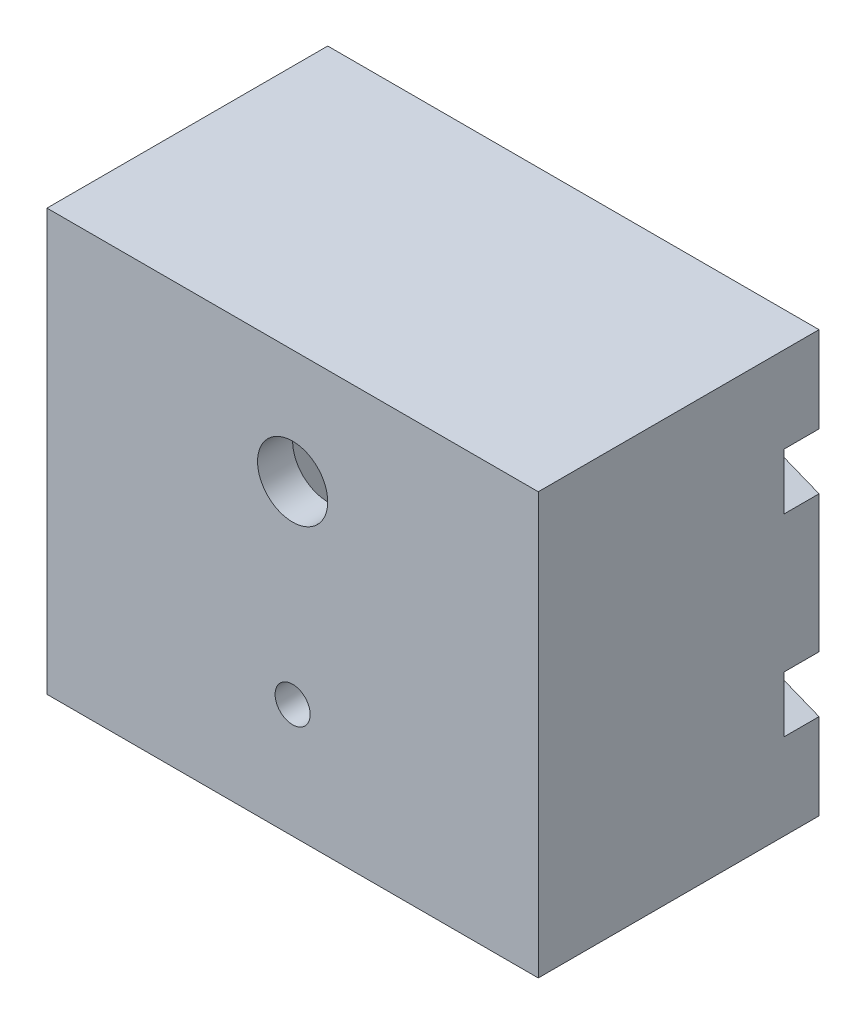
ISO-10303-21;
HEADER;
FILE_DESCRIPTION(('STEP AP214'),'2;1');
FILE_NAME('part.step','',(''),(''),'','','');
FILE_SCHEMA(('AUTOMOTIVE_DESIGN { 1 0 10303 214 1 1 1 1 }'));
ENDSEC;
DATA;
#1=APPLICATION_CONTEXT('core data for automotive mechanical design processes');
#2=APPLICATION_PROTOCOL_DEFINITION('international standard','automotive_design',2000,#1);
#3=PRODUCT_CONTEXT('',#1,'mechanical');
#4=PRODUCT('Part','Part','',(#3));
#5=PRODUCT_RELATED_PRODUCT_CATEGORY('part','',(#4));
#6=PRODUCT_DEFINITION_FORMATION('','',#4);
#7=PRODUCT_DEFINITION_CONTEXT('part definition',#1,'design');
#8=PRODUCT_DEFINITION('design','',#6,#7);
#9=PRODUCT_DEFINITION_SHAPE('','',#8);
#10=(LENGTH_UNIT() NAMED_UNIT(*) SI_UNIT(.MILLI.,.METRE.));
#11=(NAMED_UNIT(*) PLANE_ANGLE_UNIT() SI_UNIT($,.RADIAN.));
#12=(NAMED_UNIT(*) SI_UNIT($,.STERADIAN.) SOLID_ANGLE_UNIT());
#13=UNCERTAINTY_MEASURE_WITH_UNIT(LENGTH_MEASURE(1.E-05),#10,'distance_accuracy_value','');
#14=(GEOMETRIC_REPRESENTATION_CONTEXT(3) GLOBAL_UNCERTAINTY_ASSIGNED_CONTEXT((#13)) GLOBAL_UNIT_ASSIGNED_CONTEXT((#10,
#11,#12)) REPRESENTATION_CONTEXT('',''));
#15=CARTESIAN_POINT('',(0.,0.,0.));
#16=DIRECTION('',(0.,0.,1.));
#17=DIRECTION('',(1.,0.,0.));
#18=AXIS2_PLACEMENT_3D('',#15,#16,#17);
#19=CARTESIAN_POINT('',(0.,0.,0.));
#20=DIRECTION('',(0.,0.,-1.));
#21=DIRECTION('',(-1.,0.,0.));
#22=AXIS2_PLACEMENT_3D('',#19,#20,#21);
#23=PLANE('',#22);
#24=DIRECTION('',(0.928476690885259,0.371390676354104,0.));
#25=VECTOR('',#24,1.);
#26=CARTESIAN_POINT('',(44.45,12.85875,0.));
#27=LINE('',#26,#25);
#28=CARTESIAN_POINT('',(41.275,11.58875,0.));
#29=VERTEX_POINT('',#28);
#30=CARTESIAN_POINT('',(44.45,12.85875,0.));
#31=VERTEX_POINT('',#30);
#32=EDGE_CURVE('E459',#29,#31,#27,.T.);
#33=ORIENTED_EDGE('',*,*,#32,.F.);
#34=DIRECTION('',(0.,-1.,0.));
#35=VECTOR('',#34,1.);
#36=CARTESIAN_POINT('',(41.275,3.175,0.));
#37=LINE('',#36,#35);
#38=CARTESIAN_POINT('',(41.275,26.51125,0.));
#39=VERTEX_POINT('',#38);
#40=EDGE_CURVE('E318',#39,#29,#37,.T.);
#41=ORIENTED_EDGE('',*,*,#40,.F.);
#42=DIRECTION('',(-0.928476690885259,0.371390676354104,0.));
#43=VECTOR('',#42,1.);
#44=CARTESIAN_POINT('',(44.45,25.24125,0.));
#45=LINE('',#44,#43);
#46=CARTESIAN_POINT('',(44.45,25.24125,0.));
#47=VERTEX_POINT('',#46);
#48=EDGE_CURVE('E431',#47,#39,#45,.T.);
#49=ORIENTED_EDGE('',*,*,#48,.F.);
#50=DIRECTION('',(0.,1.,0.));
#51=VECTOR('',#50,1.);
#52=CARTESIAN_POINT('',(44.45,0.,0.));
#53=LINE('',#52,#51);
#54=EDGE_CURVE('E258',#31,#47,#53,.T.);
#55=ORIENTED_EDGE('',*,*,#54,.F.);
#56=EDGE_LOOP('',(#33,#41,#49,#55));
#57=FACE_BOUND('',#56,.T.);
#58=ADVANCED_FACE('F45',(#57),#23,.T.);
#59=DIRECTION('',(-0.928476690885259,-0.371390676354104,0.));
#60=VECTOR('',#59,1.);
#61=CARTESIAN_POINT('',(0.,25.24125,0.));
#62=LINE('',#61,#60);
#63=CARTESIAN_POINT('',(3.175,26.51125,0.));
#64=VERTEX_POINT('',#63);
#65=CARTESIAN_POINT('',(0.,25.24125,0.));
#66=VERTEX_POINT('',#65);
#67=EDGE_CURVE('E405',#64,#66,#62,.T.);
#68=ORIENTED_EDGE('',*,*,#67,.F.);
#69=DIRECTION('',(0.,1.,0.));
#70=VECTOR('',#69,1.);
#71=CARTESIAN_POINT('',(3.175,3.175,0.));
#72=LINE('',#71,#70);
#73=CARTESIAN_POINT('',(3.175,11.58875,0.));
#74=VERTEX_POINT('',#73);
#75=EDGE_CURVE('E230',#74,#64,#72,.T.);
#76=ORIENTED_EDGE('',*,*,#75,.F.);
#77=DIRECTION('',(0.928476690885259,-0.371390676354104,0.));
#78=VECTOR('',#77,1.);
#79=CARTESIAN_POINT('',(0.,12.85875,0.));
#80=LINE('',#79,#78);
#81=CARTESIAN_POINT('',(0.,12.85875,0.));
#82=VERTEX_POINT('',#81);
#83=EDGE_CURVE('E213',#82,#74,#80,.T.);
#84=ORIENTED_EDGE('',*,*,#83,.F.);
#85=DIRECTION('',(0.,-1.,0.));
#86=VECTOR('',#85,1.);
#87=CARTESIAN_POINT('',(0.,0.,0.));
#88=LINE('',#87,#86);
#89=EDGE_CURVE('E228',#66,#82,#88,.T.);
#90=ORIENTED_EDGE('',*,*,#89,.F.);
#91=EDGE_LOOP('',(#68,#76,#84,#90));
#92=FACE_BOUND('',#91,.T.);
#93=ADVANCED_FACE('F227',(#92),#23,.T.);
#94=DIRECTION('',(0.928476690885259,-0.371390676354104,0.));
#95=VECTOR('',#94,1.);
#96=CARTESIAN_POINT('',(3.175,29.05125,0.));
#97=LINE('',#96,#95);
#98=CARTESIAN_POINT('',(0.,30.32125,0.));
#99=VERTEX_POINT('',#98);
#100=CARTESIAN_POINT('',(3.175,29.05125,0.));
#101=VERTEX_POINT('',#100);
#102=EDGE_CURVE('E379',#99,#101,#97,.T.);
#103=ORIENTED_EDGE('',*,*,#102,.F.);
#104=CARTESIAN_POINT('',(0.,38.1,0.));
#105=VERTEX_POINT('',#104);
#106=EDGE_CURVE('E238',#105,#99,#88,.T.);
#107=ORIENTED_EDGE('',*,*,#106,.F.);
#108=DIRECTION('',(-1.,0.,0.));
#109=VECTOR('',#108,1.);
#110=CARTESIAN_POINT('',(0.,38.1,0.));
#111=LINE('',#110,#109);
#112=CARTESIAN_POINT('',(44.45,38.1,0.));
#113=VERTEX_POINT('',#112);
#114=EDGE_CURVE('E257',#113,#105,#111,.T.);
#115=ORIENTED_EDGE('',*,*,#114,.F.);
#116=CARTESIAN_POINT('',(44.45,30.32125,0.));
#117=VERTEX_POINT('',#116);
#118=EDGE_CURVE('E252',#117,#113,#53,.T.);
#119=ORIENTED_EDGE('',*,*,#118,.F.);
#120=DIRECTION('',(0.928476690885259,0.371390676354104,0.));
#121=VECTOR('',#120,1.);
#122=CARTESIAN_POINT('',(41.275,29.05125,0.));
#123=LINE('',#122,#121);
#124=CARTESIAN_POINT('',(41.275,29.05125,0.));
#125=VERTEX_POINT('',#124);
#126=EDGE_CURVE('E421',#125,#117,#123,.T.);
#127=ORIENTED_EDGE('',*,*,#126,.F.);
#128=CARTESIAN_POINT('',(41.275,34.925,0.));
#129=VERTEX_POINT('',#128);
#130=EDGE_CURVE('E313',#129,#125,#37,.T.);
#131=ORIENTED_EDGE('',*,*,#130,.F.);
#132=DIRECTION('',(1.,0.,0.));
#133=VECTOR('',#132,1.);
#134=CARTESIAN_POINT('',(41.275,34.925,0.));
#135=LINE('',#134,#133);
#136=CARTESIAN_POINT('',(3.175,34.925,0.));
#137=VERTEX_POINT('',#136);
#138=EDGE_CURVE('E300',#137,#129,#135,.T.);
#139=ORIENTED_EDGE('',*,*,#138,.F.);
#140=EDGE_CURVE('E322',#101,#137,#72,.T.);
#141=ORIENTED_EDGE('',*,*,#140,.F.);
#142=EDGE_LOOP('',(#103,#107,#115,#119,#127,#131,#139,#141));
#143=FACE_BOUND('',#142,.T.);
#144=ADVANCED_FACE('F376',(#143),#23,.T.);
#145=CARTESIAN_POINT('',(0.,0.,25.4));
#146=DIRECTION('',(1.,0.,0.));
#147=DIRECTION('',(0.,0.,-1.));
#148=AXIS2_PLACEMENT_3D('',#145,#146,#147);
#149=PLANE('',#148);
#150=DIRECTION('',(0.,1.,0.));
#151=VECTOR('',#150,1.);
#152=CARTESIAN_POINT('',(0.,25.24125,3.175));
#153=LINE('',#152,#151);
#154=CARTESIAN_POINT('',(0.,25.24125,3.175));
#155=VERTEX_POINT('',#154);
#156=CARTESIAN_POINT('',(0.,30.32125,3.175));
#157=VERTEX_POINT('',#156);
#158=EDGE_CURVE('E383',#155,#157,#153,.T.);
#159=ORIENTED_EDGE('',*,*,#158,.F.);
#160=DIRECTION('',(0.,0.,-1.));
#161=VECTOR('',#160,1.);
#162=CARTESIAN_POINT('',(0.,25.24125,3.175));
#163=LINE('',#162,#161);
#164=EDGE_CURVE('E232',#155,#66,#163,.T.);
#165=ORIENTED_EDGE('',*,*,#164,.T.);
#166=ORIENTED_EDGE('',*,*,#89,.T.);
#167=DIRECTION('',(0.,0.,-1.));
#168=VECTOR('',#167,1.);
#169=CARTESIAN_POINT('',(0.,12.85875,3.175));
#170=LINE('',#169,#168);
#171=CARTESIAN_POINT('',(0.,12.85875,3.175));
#172=VERTEX_POINT('',#171);
#173=EDGE_CURVE('E209',#172,#82,#170,.T.);
#174=ORIENTED_EDGE('',*,*,#173,.F.);
#175=DIRECTION('',(0.,1.,0.));
#176=VECTOR('',#175,1.);
#177=CARTESIAN_POINT('',(0.,12.85875,3.175));
#178=LINE('',#177,#176);
#179=CARTESIAN_POINT('',(0.,7.77874999999999,3.175));
#180=VERTEX_POINT('',#179);
#181=EDGE_CURVE('E737',#180,#172,#178,.T.);
#182=ORIENTED_EDGE('',*,*,#181,.F.);
#183=DIRECTION('',(0.,0.,-1.));
#184=VECTOR('',#183,1.);
#185=CARTESIAN_POINT('',(0.,7.77874999999999,3.175));
#186=LINE('',#185,#184);
#187=CARTESIAN_POINT('',(0.,7.77874999999999,0.));
#188=VERTEX_POINT('',#187);
#189=EDGE_CURVE('E221',#180,#188,#186,.T.);
#190=ORIENTED_EDGE('',*,*,#189,.T.);
#191=CARTESIAN_POINT('',(0.,0.,0.));
#192=VERTEX_POINT('',#191);
#193=EDGE_CURVE('E239',#188,#192,#88,.T.);
#194=ORIENTED_EDGE('',*,*,#193,.T.);
#195=DIRECTION('',(0.,0.,-1.));
#196=VECTOR('',#195,1.);
#197=CARTESIAN_POINT('',(0.,0.,25.4));
#198=LINE('',#197,#196);
#199=CARTESIAN_POINT('',(0.,0.,25.4));
#200=VERTEX_POINT('',#199);
#201=EDGE_CURVE('E11',#200,#192,#198,.T.);
#202=ORIENTED_EDGE('',*,*,#201,.F.);
#203=DIRECTION('',(0.,-1.,0.));
#204=VECTOR('',#203,1.);
#205=CARTESIAN_POINT('',(0.,0.,25.4));
#206=LINE('',#205,#204);
#207=CARTESIAN_POINT('',(0.,38.1,25.4));
#208=VERTEX_POINT('',#207);
#209=EDGE_CURVE('E261',#208,#200,#206,.T.);
#210=ORIENTED_EDGE('',*,*,#209,.F.);
#211=DIRECTION('',(0.,0.,-1.));
#212=VECTOR('',#211,1.);
#213=CARTESIAN_POINT('',(0.,38.1,25.4));
#214=LINE('',#213,#212);
#215=EDGE_CURVE('E262',#208,#105,#214,.T.);
#216=ORIENTED_EDGE('',*,*,#215,.T.);
#217=ORIENTED_EDGE('',*,*,#106,.T.);
#218=DIRECTION('',(0.,0.,-1.));
#219=VECTOR('',#218,1.);
#220=CARTESIAN_POINT('',(0.,30.32125,3.175));
#221=LINE('',#220,#219);
#222=EDGE_CURVE('E381',#157,#99,#221,.T.);
#223=ORIENTED_EDGE('',*,*,#222,.F.);
#224=EDGE_LOOP('',(#159,#165,#166,#174,#182,#190,#194,#202,#210,#216,#217,#223));
#225=FACE_BOUND('',#224,.T.);
#226=ADVANCED_FACE('F47',(#225),#149,.F.);
#227=CARTESIAN_POINT('',(0.,0.,25.4));
#228=DIRECTION('',(0.,1.,0.));
#229=DIRECTION('',(0.,0.,1.));
#230=AXIS2_PLACEMENT_3D('',#227,#228,#229);
#231=PLANE('',#230);
#232=DIRECTION('',(1.,0.,0.));
#233=VECTOR('',#232,1.);
#234=CARTESIAN_POINT('',(0.,0.,0.));
#235=LINE('',#234,#233);
#236=CARTESIAN_POINT('',(44.45,0.,0.));
#237=VERTEX_POINT('',#236);
#238=EDGE_CURVE('E244',#192,#237,#235,.T.);
#239=ORIENTED_EDGE('',*,*,#238,.T.);
#240=DIRECTION('',(0.,0.,-1.));
#241=VECTOR('',#240,1.);
#242=CARTESIAN_POINT('',(44.45,0.,25.4));
#243=LINE('',#242,#241);
#244=CARTESIAN_POINT('',(44.45,0.,25.4));
#245=VERTEX_POINT('',#244);
#246=EDGE_CURVE('E55',#245,#237,#243,.T.);
#247=ORIENTED_EDGE('',*,*,#246,.F.);
#248=DIRECTION('',(1.,0.,0.));
#249=VECTOR('',#248,1.);
#250=CARTESIAN_POINT('',(0.,0.,25.4));
#251=LINE('',#250,#249);
#252=EDGE_CURVE('E345',#200,#245,#251,.T.);
#253=ORIENTED_EDGE('',*,*,#252,.F.);
#254=ORIENTED_EDGE('',*,*,#201,.T.);
#255=EDGE_LOOP('',(#239,#247,#253,#254));
#256=FACE_BOUND('',#255,.T.);
#257=ADVANCED_FACE('F366',(#256),#231,.F.);
#258=CARTESIAN_POINT('',(44.45,0.,25.4));
#259=DIRECTION('',(-1.,0.,0.));
#260=DIRECTION('',(0.,0.,1.));
#261=AXIS2_PLACEMENT_3D('',#258,#259,#260);
#262=PLANE('',#261);
#263=DIRECTION('',(0.,-1.,0.));
#264=VECTOR('',#263,1.);
#265=CARTESIAN_POINT('',(44.45,12.85875,3.175));
#266=LINE('',#265,#264);
#267=CARTESIAN_POINT('',(44.45,12.85875,3.175));
#268=VERTEX_POINT('',#267);
#269=CARTESIAN_POINT('',(44.45,7.77874999999999,3.175));
#270=VERTEX_POINT('',#269);
#271=EDGE_CURVE('E398',#268,#270,#266,.T.);
#272=ORIENTED_EDGE('',*,*,#271,.F.);
#273=DIRECTION('',(0.,0.,-1.));
#274=VECTOR('',#273,1.);
#275=CARTESIAN_POINT('',(44.45,12.85875,3.175));
#276=LINE('',#275,#274);
#277=EDGE_CURVE('E409',#268,#31,#276,.T.);
#278=ORIENTED_EDGE('',*,*,#277,.T.);
#279=ORIENTED_EDGE('',*,*,#54,.T.);
#280=DIRECTION('',(0.,0.,-1.));
#281=VECTOR('',#280,1.);
#282=CARTESIAN_POINT('',(44.45,25.24125,3.175));
#283=LINE('',#282,#281);
#284=CARTESIAN_POINT('',(44.45,25.24125,3.175));
#285=VERTEX_POINT('',#284);
#286=EDGE_CURVE('E289',#285,#47,#283,.T.);
#287=ORIENTED_EDGE('',*,*,#286,.F.);
#288=DIRECTION('',(0.,-1.,0.));
#289=VECTOR('',#288,1.);
#290=CARTESIAN_POINT('',(44.45,25.24125,3.175));
#291=LINE('',#290,#289);
#292=CARTESIAN_POINT('',(44.45,30.32125,3.175));
#293=VERTEX_POINT('',#292);
#294=EDGE_CURVE('E428',#293,#285,#291,.T.);
#295=ORIENTED_EDGE('',*,*,#294,.F.);
#296=DIRECTION('',(0.,0.,-1.));
#297=VECTOR('',#296,1.);
#298=CARTESIAN_POINT('',(44.45,30.32125,3.175));
#299=LINE('',#298,#297);
#300=EDGE_CURVE('E439',#293,#117,#299,.T.);
#301=ORIENTED_EDGE('',*,*,#300,.T.);
#302=ORIENTED_EDGE('',*,*,#118,.T.);
#303=DIRECTION('',(0.,0.,-1.));
#304=VECTOR('',#303,1.);
#305=CARTESIAN_POINT('',(44.45,38.1,25.4));
#306=LINE('',#305,#304);
#307=CARTESIAN_POINT('',(44.45,38.1,25.4));
#308=VERTEX_POINT('',#307);
#309=EDGE_CURVE('E266',#308,#113,#306,.T.);
#310=ORIENTED_EDGE('',*,*,#309,.F.);
#311=DIRECTION('',(0.,1.,0.));
#312=VECTOR('',#311,1.);
#313=CARTESIAN_POINT('',(44.45,0.,25.4));
#314=LINE('',#313,#312);
#315=EDGE_CURVE('E347',#245,#308,#314,.T.);
#316=ORIENTED_EDGE('',*,*,#315,.F.);
#317=ORIENTED_EDGE('',*,*,#246,.T.);
#318=CARTESIAN_POINT('',(44.45,7.77874999999999,0.));
#319=VERTEX_POINT('',#318);
#320=EDGE_CURVE('E253',#237,#319,#53,.T.);
#321=ORIENTED_EDGE('',*,*,#320,.T.);
#322=DIRECTION('',(0.,0.,-1.));
#323=VECTOR('',#322,1.);
#324=CARTESIAN_POINT('',(44.45,7.77874999999999,3.175));
#325=LINE('',#324,#323);
#326=EDGE_CURVE('E704',#270,#319,#325,.T.);
#327=ORIENTED_EDGE('',*,*,#326,.F.);
#328=EDGE_LOOP('',(#272,#278,#279,#287,#295,#301,#302,#310,#316,#317,#321,#327));
#329=FACE_BOUND('',#328,.T.);
#330=ADVANCED_FACE('F371',(#329),#262,.F.);
#331=CARTESIAN_POINT('',(0.,38.1,25.4));
#332=DIRECTION('',(0.,-1.,0.));
#333=DIRECTION('',(0.,0.,-1.));
#334=AXIS2_PLACEMENT_3D('',#331,#332,#333);
#335=PLANE('',#334);
#336=ORIENTED_EDGE('',*,*,#114,.T.);
#337=ORIENTED_EDGE('',*,*,#215,.F.);
#338=DIRECTION('',(-1.,0.,0.));
#339=VECTOR('',#338,1.);
#340=CARTESIAN_POINT('',(0.,38.1,25.4));
#341=LINE('',#340,#339);
#342=EDGE_CURVE('E248',#308,#208,#341,.T.);
#343=ORIENTED_EDGE('',*,*,#342,.F.);
#344=ORIENTED_EDGE('',*,*,#309,.T.);
#345=EDGE_LOOP('',(#336,#337,#343,#344));
#346=FACE_BOUND('',#345,.T.);
#347=ADVANCED_FACE('F359',(#346),#335,.F.);
#348=CARTESIAN_POINT('',(0.,0.,25.4));
#349=DIRECTION('',(0.,0.,-1.));
#350=DIRECTION('',(-1.,0.,0.));
#351=AXIS2_PLACEMENT_3D('',#348,#349,#350);
#352=PLANE('',#351);
#353=CARTESIAN_POINT('',(22.225,27.78125,25.4));
#354=DIRECTION('',(0.,0.,1.));
#355=DIRECTION('',(1.,0.,0.));
#356=AXIS2_PLACEMENT_3D('',#353,#354,#355);
#357=CIRCLE('',#356,3.175);
#358=CARTESIAN_POINT('',(25.4,27.78125,25.4));
#359=VERTEX_POINT('',#358);
#360=EDGE_CURVE('E275',#359,#359,#357,.T.);
#361=ORIENTED_EDGE('',*,*,#360,.F.);
#362=EDGE_LOOP('',(#361));
#363=FACE_BOUND('',#362,.T.);
#364=CARTESIAN_POINT('',(22.225,10.31875,25.4));
#365=DIRECTION('',(0.,0.,1.));
#366=DIRECTION('',(1.,0.,0.));
#367=AXIS2_PLACEMENT_3D('',#364,#365,#366);
#368=CIRCLE('',#367,1.5875);
#369=CARTESIAN_POINT('',(23.8125,10.31875,25.4));
#370=VERTEX_POINT('',#369);
#371=EDGE_CURVE('E283',#370,#370,#368,.T.);
#372=ORIENTED_EDGE('',*,*,#371,.F.);
#373=EDGE_LOOP('',(#372));
#374=FACE_BOUND('',#373,.T.);
#375=ORIENTED_EDGE('',*,*,#209,.T.);
#376=ORIENTED_EDGE('',*,*,#252,.T.);
#377=ORIENTED_EDGE('',*,*,#315,.T.);
#378=ORIENTED_EDGE('',*,*,#342,.T.);
#379=EDGE_LOOP('',(#375,#376,#377,#378));
#380=FACE_BOUND('',#379,.T.);
#381=ADVANCED_FACE('F355',(#363,#374,#380),#352,.F.);
#382=DIRECTION('',(-0.928476690885259,0.371390676354105,0.));
#383=VECTOR('',#382,1.);
#384=CARTESIAN_POINT('',(41.275,9.04874999999999,0.));
#385=LINE('',#384,#383);
#386=CARTESIAN_POINT('',(41.275,9.04874999999999,0.));
#387=VERTEX_POINT('',#386);
#388=EDGE_CURVE('E434',#319,#387,#385,.T.);
#389=ORIENTED_EDGE('',*,*,#388,.F.);
#390=ORIENTED_EDGE('',*,*,#320,.F.);
#391=ORIENTED_EDGE('',*,*,#238,.F.);
#392=ORIENTED_EDGE('',*,*,#193,.F.);
#393=DIRECTION('',(-0.928476690885259,-0.371390676354105,0.));
#394=VECTOR('',#393,1.);
#395=CARTESIAN_POINT('',(3.175,9.04874999999999,0.));
#396=LINE('',#395,#394);
#397=CARTESIAN_POINT('',(3.175,9.04874999999999,0.));
#398=VERTEX_POINT('',#397);
#399=EDGE_CURVE('E233',#398,#188,#396,.T.);
#400=ORIENTED_EDGE('',*,*,#399,.F.);
#401=CARTESIAN_POINT('',(3.175,3.175,0.));
#402=VERTEX_POINT('',#401);
#403=EDGE_CURVE('E323',#402,#398,#72,.T.);
#404=ORIENTED_EDGE('',*,*,#403,.F.);
#405=DIRECTION('',(-1.,0.,0.));
#406=VECTOR('',#405,1.);
#407=CARTESIAN_POINT('',(41.275,3.175,0.));
#408=LINE('',#407,#406);
#409=CARTESIAN_POINT('',(41.275,3.175,0.));
#410=VERTEX_POINT('',#409);
#411=EDGE_CURVE('E317',#410,#402,#408,.T.);
#412=ORIENTED_EDGE('',*,*,#411,.F.);
#413=EDGE_CURVE('E281',#387,#410,#37,.T.);
#414=ORIENTED_EDGE('',*,*,#413,.F.);
#415=EDGE_LOOP('',(#389,#390,#391,#392,#400,#404,#412,#414));
#416=FACE_BOUND('',#415,.T.);
#417=ADVANCED_FACE('F474',(#416),#23,.T.);
#418=CARTESIAN_POINT('',(41.275,3.175,22.225));
#419=DIRECTION('',(1.,0.,0.));
#420=DIRECTION('',(0.,0.,-1.));
#421=AXIS2_PLACEMENT_3D('',#418,#419,#420);
#422=PLANE('',#421);
#423=ORIENTED_EDGE('',*,*,#40,.T.);
#424=DIRECTION('',(0.,0.,-1.));
#425=VECTOR('',#424,1.);
#426=CARTESIAN_POINT('',(41.275,11.58875,3.175));
#427=LINE('',#426,#425);
#428=CARTESIAN_POINT('',(41.275,11.58875,3.175));
#429=VERTEX_POINT('',#428);
#430=EDGE_CURVE('E711',#429,#29,#427,.T.);
#431=ORIENTED_EDGE('',*,*,#430,.F.);
#432=DIRECTION('',(0.,1.,0.));
#433=VECTOR('',#432,1.);
#434=CARTESIAN_POINT('',(41.275,11.58875,3.175));
#435=LINE('',#434,#433);
#436=CARTESIAN_POINT('',(41.275,9.04874999999999,3.175));
#437=VERTEX_POINT('',#436);
#438=EDGE_CURVE('E709',#437,#429,#435,.T.);
#439=ORIENTED_EDGE('',*,*,#438,.F.);
#440=DIRECTION('',(0.,0.,-1.));
#441=VECTOR('',#440,1.);
#442=CARTESIAN_POINT('',(41.275,9.04874999999999,3.175));
#443=LINE('',#442,#441);
#444=EDGE_CURVE('E467',#437,#387,#443,.T.);
#445=ORIENTED_EDGE('',*,*,#444,.T.);
#446=ORIENTED_EDGE('',*,*,#413,.T.);
#447=DIRECTION('',(0.,0.,-1.));
#448=VECTOR('',#447,1.);
#449=CARTESIAN_POINT('',(41.275,3.175,22.225));
#450=LINE('',#449,#448);
#451=CARTESIAN_POINT('',(41.275,3.175,22.225));
#452=VERTEX_POINT('',#451);
#453=EDGE_CURVE('E312',#452,#410,#450,.T.);
#454=ORIENTED_EDGE('',*,*,#453,.F.);
#455=DIRECTION('',(0.,-1.,0.));
#456=VECTOR('',#455,1.);
#457=CARTESIAN_POINT('',(41.275,3.175,22.225));
#458=LINE('',#457,#456);
#459=CARTESIAN_POINT('',(41.275,34.925,22.225));
#460=VERTEX_POINT('',#459);
#461=EDGE_CURVE('E295',#460,#452,#458,.T.);
#462=ORIENTED_EDGE('',*,*,#461,.F.);
#463=DIRECTION('',(0.,0.,-1.));
#464=VECTOR('',#463,1.);
#465=CARTESIAN_POINT('',(41.275,34.925,22.225));
#466=LINE('',#465,#464);
#467=EDGE_CURVE('E245',#460,#129,#466,.T.);
#468=ORIENTED_EDGE('',*,*,#467,.T.);
#469=ORIENTED_EDGE('',*,*,#130,.T.);
#470=DIRECTION('',(0.,0.,-1.));
#471=VECTOR('',#470,1.);
#472=CARTESIAN_POINT('',(41.275,29.05125,3.175));
#473=LINE('',#472,#471);
#474=CARTESIAN_POINT('',(41.275,29.05125,3.175));
#475=VERTEX_POINT('',#474);
#476=EDGE_CURVE('E441',#475,#125,#473,.T.);
#477=ORIENTED_EDGE('',*,*,#476,.F.);
#478=DIRECTION('',(0.,1.,0.));
#479=VECTOR('',#478,1.);
#480=CARTESIAN_POINT('',(41.275,26.51125,3.175));
#481=LINE('',#480,#479);
#482=CARTESIAN_POINT('',(41.275,26.51125,3.175));
#483=VERTEX_POINT('',#482);
#484=EDGE_CURVE('E420',#483,#475,#481,.T.);
#485=ORIENTED_EDGE('',*,*,#484,.F.);
#486=DIRECTION('',(0.,0.,-1.));
#487=VECTOR('',#486,1.);
#488=CARTESIAN_POINT('',(41.275,26.51125,3.175));
#489=LINE('',#488,#487);
#490=EDGE_CURVE('E292',#483,#39,#489,.T.);
#491=ORIENTED_EDGE('',*,*,#490,.T.);
#492=EDGE_LOOP('',(#423,#431,#439,#445,#446,#454,#462,#468,#469,#477,#485,#491));
#493=FACE_BOUND('',#492,.T.);
#494=ADVANCED_FACE('F451',(#493),#422,.F.);
#495=CARTESIAN_POINT('',(41.275,34.925,22.225));
#496=DIRECTION('',(0.,1.,0.));
#497=DIRECTION('',(0.,0.,1.));
#498=AXIS2_PLACEMENT_3D('',#495,#496,#497);
#499=PLANE('',#498);
#500=ORIENTED_EDGE('',*,*,#138,.T.);
#501=ORIENTED_EDGE('',*,*,#467,.F.);
#502=DIRECTION('',(1.,0.,0.));
#503=VECTOR('',#502,1.);
#504=CARTESIAN_POINT('',(41.275,34.925,22.225));
#505=LINE('',#504,#503);
#506=CARTESIAN_POINT('',(3.175,34.925,22.225));
#507=VERTEX_POINT('',#506);
#508=EDGE_CURVE('E308',#507,#460,#505,.T.);
#509=ORIENTED_EDGE('',*,*,#508,.F.);
#510=DIRECTION('',(0.,0.,-1.));
#511=VECTOR('',#510,1.);
#512=CARTESIAN_POINT('',(3.175,34.925,22.225));
#513=LINE('',#512,#511);
#514=EDGE_CURVE('E332',#507,#137,#513,.T.);
#515=ORIENTED_EDGE('',*,*,#514,.T.);
#516=EDGE_LOOP('',(#500,#501,#509,#515));
#517=FACE_BOUND('',#516,.T.);
#518=ADVANCED_FACE('F488',(#517),#499,.F.);
#519=CARTESIAN_POINT('',(3.175,3.175,22.225));
#520=DIRECTION('',(-1.,0.,0.));
#521=DIRECTION('',(0.,0.,1.));
#522=AXIS2_PLACEMENT_3D('',#519,#520,#521);
#523=PLANE('',#522);
#524=ORIENTED_EDGE('',*,*,#75,.T.);
#525=DIRECTION('',(0.,0.,-1.));
#526=VECTOR('',#525,1.);
#527=CARTESIAN_POINT('',(3.175,26.51125,3.175));
#528=LINE('',#527,#526);
#529=CARTESIAN_POINT('',(3.175,26.51125,3.175));
#530=VERTEX_POINT('',#529);
#531=EDGE_CURVE('E395',#530,#64,#528,.T.);
#532=ORIENTED_EDGE('',*,*,#531,.F.);
#533=DIRECTION('',(0.,-1.,0.));
#534=VECTOR('',#533,1.);
#535=CARTESIAN_POINT('',(3.175,26.51125,3.175));
#536=LINE('',#535,#534);
#537=CARTESIAN_POINT('',(3.175,29.05125,3.175));
#538=VERTEX_POINT('',#537);
#539=EDGE_CURVE('E392',#538,#530,#536,.T.);
#540=ORIENTED_EDGE('',*,*,#539,.F.);
#541=DIRECTION('',(0.,0.,-1.));
#542=VECTOR('',#541,1.);
#543=CARTESIAN_POINT('',(3.175,29.05125,3.175));
#544=LINE('',#543,#542);
#545=EDGE_CURVE('E387',#538,#101,#544,.T.);
#546=ORIENTED_EDGE('',*,*,#545,.T.);
#547=ORIENTED_EDGE('',*,*,#140,.T.);
#548=ORIENTED_EDGE('',*,*,#514,.F.);
#549=DIRECTION('',(0.,1.,0.));
#550=VECTOR('',#549,1.);
#551=CARTESIAN_POINT('',(3.175,3.175,22.225));
#552=LINE('',#551,#550);
#553=CARTESIAN_POINT('',(3.175,3.175,22.225));
#554=VERTEX_POINT('',#553);
#555=EDGE_CURVE('E304',#554,#507,#552,.T.);
#556=ORIENTED_EDGE('',*,*,#555,.F.);
#557=DIRECTION('',(0.,0.,-1.));
#558=VECTOR('',#557,1.);
#559=CARTESIAN_POINT('',(3.175,3.175,22.225));
#560=LINE('',#559,#558);
#561=EDGE_CURVE('E336',#554,#402,#560,.T.);
#562=ORIENTED_EDGE('',*,*,#561,.T.);
#563=ORIENTED_EDGE('',*,*,#403,.T.);
#564=DIRECTION('',(0.,0.,-1.));
#565=VECTOR('',#564,1.);
#566=CARTESIAN_POINT('',(3.175,9.04874999999999,3.175));
#567=LINE('',#566,#565);
#568=CARTESIAN_POINT('',(3.175,9.04874999999999,3.175));
#569=VERTEX_POINT('',#568);
#570=EDGE_CURVE('E480',#569,#398,#567,.T.);
#571=ORIENTED_EDGE('',*,*,#570,.F.);
#572=DIRECTION('',(0.,-1.,0.));
#573=VECTOR('',#572,1.);
#574=CARTESIAN_POINT('',(3.175,11.58875,3.175));
#575=LINE('',#574,#573);
#576=CARTESIAN_POINT('',(3.175,11.58875,3.175));
#577=VERTEX_POINT('',#576);
#578=EDGE_CURVE('E729',#577,#569,#575,.T.);
#579=ORIENTED_EDGE('',*,*,#578,.F.);
#580=DIRECTION('',(0.,0.,-1.));
#581=VECTOR('',#580,1.);
#582=CARTESIAN_POINT('',(3.175,11.58875,3.175));
#583=LINE('',#582,#581);
#584=EDGE_CURVE('E739',#577,#74,#583,.T.);
#585=ORIENTED_EDGE('',*,*,#584,.T.);
#586=EDGE_LOOP('',(#524,#532,#540,#546,#547,#548,#556,#562,#563,#571,#579,#585));
#587=FACE_BOUND('',#586,.T.);
#588=ADVANCED_FACE('F478',(#587),#523,.F.);
#589=CARTESIAN_POINT('',(41.275,3.175,22.225));
#590=DIRECTION('',(0.,-1.,0.));
#591=DIRECTION('',(0.,0.,-1.));
#592=AXIS2_PLACEMENT_3D('',#589,#590,#591);
#593=PLANE('',#592);
#594=ORIENTED_EDGE('',*,*,#411,.T.);
#595=ORIENTED_EDGE('',*,*,#561,.F.);
#596=DIRECTION('',(-1.,0.,0.));
#597=VECTOR('',#596,1.);
#598=CARTESIAN_POINT('',(41.275,3.175,22.225));
#599=LINE('',#598,#597);
#600=EDGE_CURVE('E299',#452,#554,#599,.T.);
#601=ORIENTED_EDGE('',*,*,#600,.F.);
#602=ORIENTED_EDGE('',*,*,#453,.T.);
#603=EDGE_LOOP('',(#594,#595,#601,#602));
#604=FACE_BOUND('',#603,.T.);
#605=ADVANCED_FACE('F472',(#604),#593,.F.);
#606=CARTESIAN_POINT('',(0.,0.,22.225));
#607=DIRECTION('',(0.,0.,1.));
#608=DIRECTION('',(1.,0.,0.));
#609=AXIS2_PLACEMENT_3D('',#606,#607,#608);
#610=PLANE('',#609);
#611=CARTESIAN_POINT('',(22.225,27.78125,22.225));
#612=DIRECTION('',(0.,0.,1.));
#613=DIRECTION('',(1.,0.,0.));
#614=AXIS2_PLACEMENT_3D('',#611,#612,#613);
#615=CIRCLE('',#614,3.175);
#616=CARTESIAN_POINT('',(25.4,27.78125,22.225));
#617=VERTEX_POINT('',#616);
#618=EDGE_CURVE('E49',#617,#617,#615,.T.);
#619=ORIENTED_EDGE('',*,*,#618,.T.);
#620=EDGE_LOOP('',(#619));
#621=FACE_BOUND('',#620,.T.);
#622=CARTESIAN_POINT('',(22.225,10.31875,22.225));
#623=DIRECTION('',(0.,0.,1.));
#624=DIRECTION('',(1.,0.,0.));
#625=AXIS2_PLACEMENT_3D('',#622,#623,#624);
#626=CIRCLE('',#625,1.5875);
#627=CARTESIAN_POINT('',(23.8125,10.31875,22.225));
#628=VERTEX_POINT('',#627);
#629=EDGE_CURVE('E272',#628,#628,#626,.T.);
#630=ORIENTED_EDGE('',*,*,#629,.T.);
#631=EDGE_LOOP('',(#630));
#632=FACE_BOUND('',#631,.T.);
#633=ORIENTED_EDGE('',*,*,#461,.T.);
#634=ORIENTED_EDGE('',*,*,#600,.T.);
#635=ORIENTED_EDGE('',*,*,#555,.T.);
#636=ORIENTED_EDGE('',*,*,#508,.T.);
#637=EDGE_LOOP('',(#633,#634,#635,#636));
#638=FACE_BOUND('',#637,.T.);
#639=ADVANCED_FACE('F484',(#621,#632,#638),#610,.F.);
#640=CARTESIAN_POINT('',(22.225,10.31875,3.175));
#641=DIRECTION('',(0.,0.,1.));
#642=DIRECTION('',(1.,0.,0.));
#643=AXIS2_PLACEMENT_3D('',#640,#641,#642);
#644=CYLINDRICAL_SURFACE('',#643,1.5875);
#645=ORIENTED_EDGE('',*,*,#371,.T.);
#646=EDGE_LOOP('',(#645));
#647=FACE_BOUND('',#646,.T.);
#648=ORIENTED_EDGE('',*,*,#629,.F.);
#649=EDGE_LOOP('',(#648));
#650=FACE_BOUND('',#649,.T.);
#651=ADVANCED_FACE('F564',(#647,#650),#644,.F.);
#652=CARTESIAN_POINT('',(22.225,27.78125,3.175));
#653=DIRECTION('',(0.,0.,1.));
#654=DIRECTION('',(1.,0.,0.));
#655=AXIS2_PLACEMENT_3D('',#652,#653,#654);
#656=CYLINDRICAL_SURFACE('',#655,3.175);
#657=ORIENTED_EDGE('',*,*,#360,.T.);
#658=EDGE_LOOP('',(#657));
#659=FACE_BOUND('',#658,.T.);
#660=ORIENTED_EDGE('',*,*,#618,.F.);
#661=EDGE_LOOP('',(#660));
#662=FACE_BOUND('',#661,.T.);
#663=ADVANCED_FACE('F572',(#659,#662),#656,.F.);
#664=CARTESIAN_POINT('',(0.,12.85875,3.175));
#665=DIRECTION('',(0.371390676354104,0.928476690885259,0.));
#666=DIRECTION('',(-0.92847669088526,0.371390676354104,0.));
#667=AXIS2_PLACEMENT_3D('',#664,#665,#666);
#668=PLANE('',#667);
#669=ORIENTED_EDGE('',*,*,#83,.T.);
#670=ORIENTED_EDGE('',*,*,#584,.F.);
#671=DIRECTION('',(0.928476690885259,-0.371390676354104,0.));
#672=VECTOR('',#671,1.);
#673=CARTESIAN_POINT('',(0.,12.85875,3.175));
#674=LINE('',#673,#672);
#675=EDGE_CURVE('E215',#172,#577,#674,.T.);
#676=ORIENTED_EDGE('',*,*,#675,.F.);
#677=ORIENTED_EDGE('',*,*,#173,.T.);
#678=EDGE_LOOP('',(#669,#670,#676,#677));
#679=FACE_BOUND('',#678,.T.);
#680=ADVANCED_FACE('F211',(#679),#668,.F.);
#681=CARTESIAN_POINT('',(3.175,9.04874999999999,3.175));
#682=DIRECTION('',(0.371390676354105,-0.928476690885259,0.));
#683=DIRECTION('',(0.928476690885259,0.371390676354105,0.));
#684=AXIS2_PLACEMENT_3D('',#681,#682,#683);
#685=PLANE('',#684);
#686=ORIENTED_EDGE('',*,*,#399,.T.);
#687=ORIENTED_EDGE('',*,*,#189,.F.);
#688=DIRECTION('',(-0.928476690885259,-0.371390676354105,0.));
#689=VECTOR('',#688,1.);
#690=CARTESIAN_POINT('',(3.175,9.04874999999999,3.175));
#691=LINE('',#690,#689);
#692=EDGE_CURVE('E733',#569,#180,#691,.T.);
#693=ORIENTED_EDGE('',*,*,#692,.F.);
#694=ORIENTED_EDGE('',*,*,#570,.T.);
#695=EDGE_LOOP('',(#686,#687,#693,#694));
#696=FACE_BOUND('',#695,.T.);
#697=ADVANCED_FACE('F605',(#696),#685,.F.);
#698=CARTESIAN_POINT('',(0.,0.,3.175));
#699=DIRECTION('',(0.,0.,-1.));
#700=DIRECTION('',(-1.,0.,0.));
#701=AXIS2_PLACEMENT_3D('',#698,#699,#700);
#702=PLANE('',#701);
#703=ORIENTED_EDGE('',*,*,#675,.T.);
#704=ORIENTED_EDGE('',*,*,#578,.T.);
#705=ORIENTED_EDGE('',*,*,#692,.T.);
#706=ORIENTED_EDGE('',*,*,#181,.T.);
#707=EDGE_LOOP('',(#703,#704,#705,#706));
#708=FACE_BOUND('',#707,.T.);
#709=ADVANCED_FACE('F615',(#708),#702,.T.);
#710=CARTESIAN_POINT('',(0.,25.24125,3.175));
#711=DIRECTION('',(0.371390676354104,-0.928476690885259,0.));
#712=DIRECTION('',(0.928476690885259,0.371390676354104,0.));
#713=AXIS2_PLACEMENT_3D('',#710,#711,#712);
#714=PLANE('',#713);
#715=ORIENTED_EDGE('',*,*,#67,.T.);
#716=ORIENTED_EDGE('',*,*,#164,.F.);
#717=DIRECTION('',(-0.928476690885259,-0.371390676354104,0.));
#718=VECTOR('',#717,1.);
#719=CARTESIAN_POINT('',(0.,25.24125,3.175));
#720=LINE('',#719,#718);
#721=EDGE_CURVE('E386',#530,#155,#720,.T.);
#722=ORIENTED_EDGE('',*,*,#721,.F.);
#723=ORIENTED_EDGE('',*,*,#531,.T.);
#724=EDGE_LOOP('',(#715,#716,#722,#723));
#725=FACE_BOUND('',#724,.T.);
#726=ADVANCED_FACE('F625',(#725),#714,.F.);
#727=CARTESIAN_POINT('',(3.175,29.05125,3.175));
#728=DIRECTION('',(0.371390676354104,0.928476690885259,0.));
#729=DIRECTION('',(-0.928476690885259,0.371390676354104,0.));
#730=AXIS2_PLACEMENT_3D('',#727,#728,#729);
#731=PLANE('',#730);
#732=ORIENTED_EDGE('',*,*,#102,.T.);
#733=ORIENTED_EDGE('',*,*,#545,.F.);
#734=DIRECTION('',(0.928476690885259,-0.371390676354104,0.));
#735=VECTOR('',#734,1.);
#736=CARTESIAN_POINT('',(3.175,29.05125,3.175));
#737=LINE('',#736,#735);
#738=EDGE_CURVE('E413',#157,#538,#737,.T.);
#739=ORIENTED_EDGE('',*,*,#738,.F.);
#740=ORIENTED_EDGE('',*,*,#222,.T.);
#741=EDGE_LOOP('',(#732,#733,#739,#740));
#742=FACE_BOUND('',#741,.T.);
#743=ADVANCED_FACE('F635',(#742),#731,.F.);
#744=CARTESIAN_POINT('',(0.,0.,3.175));
#745=DIRECTION('',(0.,0.,1.));
#746=DIRECTION('',(1.,0.,0.));
#747=AXIS2_PLACEMENT_3D('',#744,#745,#746);
#748=PLANE('',#747);
#749=ORIENTED_EDGE('',*,*,#158,.T.);
#750=ORIENTED_EDGE('',*,*,#738,.T.);
#751=ORIENTED_EDGE('',*,*,#539,.T.);
#752=ORIENTED_EDGE('',*,*,#721,.T.);
#753=EDGE_LOOP('',(#749,#750,#751,#752));
#754=FACE_BOUND('',#753,.T.);
#755=ADVANCED_FACE('F645',(#754),#748,.F.);
#756=CARTESIAN_POINT('',(44.45,25.24125,3.175));
#757=DIRECTION('',(-0.371390676354104,-0.928476690885259,0.));
#758=DIRECTION('',(0.928476690885259,-0.371390676354104,0.));
#759=AXIS2_PLACEMENT_3D('',#756,#757,#758);
#760=PLANE('',#759);
#761=ORIENTED_EDGE('',*,*,#48,.T.);
#762=ORIENTED_EDGE('',*,*,#490,.F.);
#763=DIRECTION('',(-0.928476690885259,0.371390676354104,0.));
#764=VECTOR('',#763,1.);
#765=CARTESIAN_POINT('',(44.45,25.24125,3.175));
#766=LINE('',#765,#764);
#767=EDGE_CURVE('E71',#285,#483,#766,.T.);
#768=ORIENTED_EDGE('',*,*,#767,.F.);
#769=ORIENTED_EDGE('',*,*,#286,.T.);
#770=EDGE_LOOP('',(#761,#762,#768,#769));
#771=FACE_BOUND('',#770,.T.);
#772=ADVANCED_FACE('F503',(#771),#760,.F.);
#773=CARTESIAN_POINT('',(41.275,29.05125,3.175));
#774=DIRECTION('',(-0.371390676354104,0.928476690885259,0.));
#775=DIRECTION('',(-0.928476690885259,-0.371390676354104,0.));
#776=AXIS2_PLACEMENT_3D('',#773,#774,#775);
#777=PLANE('',#776);
#778=ORIENTED_EDGE('',*,*,#126,.T.);
#779=ORIENTED_EDGE('',*,*,#300,.F.);
#780=DIRECTION('',(0.928476690885259,0.371390676354104,0.));
#781=VECTOR('',#780,1.);
#782=CARTESIAN_POINT('',(41.275,29.05125,3.175));
#783=LINE('',#782,#781);
#784=EDGE_CURVE('E424',#475,#293,#783,.T.);
#785=ORIENTED_EDGE('',*,*,#784,.F.);
#786=ORIENTED_EDGE('',*,*,#476,.T.);
#787=EDGE_LOOP('',(#778,#779,#785,#786));
#788=FACE_BOUND('',#787,.T.);
#789=ADVANCED_FACE('F489',(#788),#777,.F.);
#790=CARTESIAN_POINT('',(0.,0.,3.175));
#791=DIRECTION('',(0.,0.,-1.));
#792=DIRECTION('',(-1.,0.,0.));
#793=AXIS2_PLACEMENT_3D('',#790,#791,#792);
#794=PLANE('',#793);
#795=ORIENTED_EDGE('',*,*,#767,.T.);
#796=ORIENTED_EDGE('',*,*,#484,.T.);
#797=ORIENTED_EDGE('',*,*,#784,.T.);
#798=ORIENTED_EDGE('',*,*,#294,.T.);
#799=EDGE_LOOP('',(#795,#796,#797,#798));
#800=FACE_BOUND('',#799,.T.);
#801=ADVANCED_FACE('F492',(#800),#794,.T.);
#802=CARTESIAN_POINT('',(44.45,12.85875,3.175));
#803=DIRECTION('',(-0.371390676354104,0.928476690885259,0.));
#804=DIRECTION('',(-0.92847669088526,-0.371390676354104,0.));
#805=AXIS2_PLACEMENT_3D('',#802,#803,#804);
#806=PLANE('',#805);
#807=ORIENTED_EDGE('',*,*,#32,.T.);
#808=ORIENTED_EDGE('',*,*,#277,.F.);
#809=DIRECTION('',(0.928476690885259,0.371390676354104,0.));
#810=VECTOR('',#809,1.);
#811=CARTESIAN_POINT('',(44.45,12.85875,3.175));
#812=LINE('',#811,#810);
#813=EDGE_CURVE('E701',#429,#268,#812,.T.);
#814=ORIENTED_EDGE('',*,*,#813,.F.);
#815=ORIENTED_EDGE('',*,*,#430,.T.);
#816=EDGE_LOOP('',(#807,#808,#814,#815));
#817=FACE_BOUND('',#816,.T.);
#818=ADVANCED_FACE('F494',(#817),#806,.F.);
#819=CARTESIAN_POINT('',(41.275,9.04874999999999,3.175));
#820=DIRECTION('',(-0.371390676354105,-0.928476690885259,0.));
#821=DIRECTION('',(0.928476690885259,-0.371390676354105,0.));
#822=AXIS2_PLACEMENT_3D('',#819,#820,#821);
#823=PLANE('',#822);
#824=ORIENTED_EDGE('',*,*,#388,.T.);
#825=ORIENTED_EDGE('',*,*,#444,.F.);
#826=DIRECTION('',(-0.928476690885259,0.371390676354105,0.));
#827=VECTOR('',#826,1.);
#828=CARTESIAN_POINT('',(41.275,9.04874999999999,3.175));
#829=LINE('',#828,#827);
#830=EDGE_CURVE('E63',#270,#437,#829,.T.);
#831=ORIENTED_EDGE('',*,*,#830,.F.);
#832=ORIENTED_EDGE('',*,*,#326,.T.);
#833=EDGE_LOOP('',(#824,#825,#831,#832));
#834=FACE_BOUND('',#833,.T.);
#835=ADVANCED_FACE('F500',(#834),#823,.F.);
#836=CARTESIAN_POINT('',(0.,0.,3.175));
#837=DIRECTION('',(0.,0.,1.));
#838=DIRECTION('',(1.,0.,0.));
#839=AXIS2_PLACEMENT_3D('',#836,#837,#838);
#840=PLANE('',#839);
#841=ORIENTED_EDGE('',*,*,#271,.T.);
#842=ORIENTED_EDGE('',*,*,#830,.T.);
#843=ORIENTED_EDGE('',*,*,#438,.T.);
#844=ORIENTED_EDGE('',*,*,#813,.T.);
#845=EDGE_LOOP('',(#841,#842,#843,#844));
#846=FACE_BOUND('',#845,.T.);
#847=ADVANCED_FACE('F686',(#846),#840,.F.);
#848=CLOSED_SHELL('',(#58,#93,#144,#226,#257,#330,#347,#381,#417,#494,#518,#588,#605,#639,#651,
#663,#680,#697,#709,#726,#743,#755,#772,#789,#801,#818,#835,#847));
#849=MANIFOLD_SOLID_BREP('B2',#848);
#850=ADVANCED_BREP_SHAPE_REPRESENTATION('',(#18,#849),#14);
#851=SHAPE_DEFINITION_REPRESENTATION(#9,#850);
ENDSEC;
END-ISO-10303-21;
